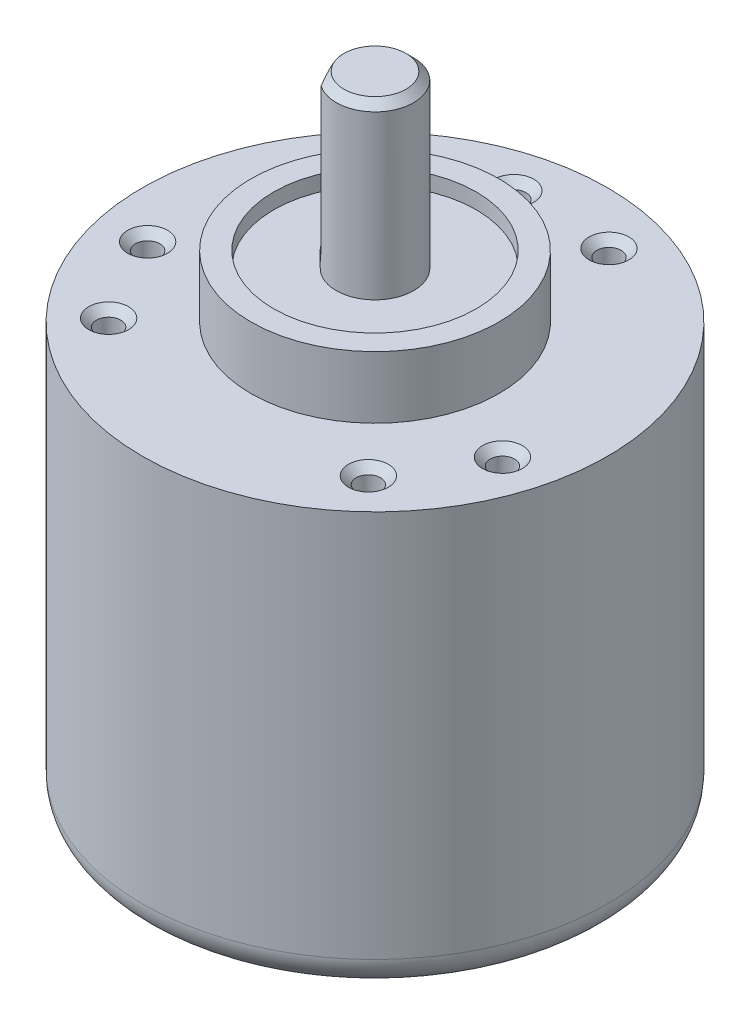
ISO-10303-21;
HEADER;
FILE_DESCRIPTION(('STEP AP214'),'2;1');
FILE_NAME('part.step','',(''),(''),'','','');
FILE_SCHEMA(('AUTOMOTIVE_DESIGN { 1 0 10303 214 1 1 1 1 }'));
ENDSEC;
DATA;
#1=APPLICATION_CONTEXT('core data for automotive mechanical design processes');
#2=APPLICATION_PROTOCOL_DEFINITION('international standard','automotive_design',2000,#1);
#3=PRODUCT_CONTEXT('',#1,'mechanical');
#4=PRODUCT('Part','Part','',(#3));
#5=PRODUCT_RELATED_PRODUCT_CATEGORY('part','',(#4));
#6=PRODUCT_DEFINITION_FORMATION('','',#4);
#7=PRODUCT_DEFINITION_CONTEXT('part definition',#1,'design');
#8=PRODUCT_DEFINITION('design','',#6,#7);
#9=PRODUCT_DEFINITION_SHAPE('','',#8);
#10=(LENGTH_UNIT() NAMED_UNIT(*) SI_UNIT(.MILLI.,.METRE.));
#11=(NAMED_UNIT(*) PLANE_ANGLE_UNIT() SI_UNIT($,.RADIAN.));
#12=(NAMED_UNIT(*) SI_UNIT($,.STERADIAN.) SOLID_ANGLE_UNIT());
#13=UNCERTAINTY_MEASURE_WITH_UNIT(LENGTH_MEASURE(1.E-05),#10,'distance_accuracy_value','');
#14=(GEOMETRIC_REPRESENTATION_CONTEXT(3) GLOBAL_UNCERTAINTY_ASSIGNED_CONTEXT((#13)) GLOBAL_UNIT_ASSIGNED_CONTEXT((#10,
#11,#12)) REPRESENTATION_CONTEXT('',''));
#15=CARTESIAN_POINT('',(0.,0.,0.));
#16=DIRECTION('',(0.,0.,1.));
#17=DIRECTION('',(1.,0.,0.));
#18=AXIS2_PLACEMENT_3D('',#15,#16,#17);
#19=CARTESIAN_POINT('',(0.,34.29,0.));
#20=DIRECTION('',(0.,-1.,0.));
#21=DIRECTION('',(0.,0.,-1.));
#22=AXIS2_PLACEMENT_3D('',#19,#20,#21);
#23=CYLINDRICAL_SURFACE('',#22,19.05);
#24=CARTESIAN_POINT('',(0.,2.54,0.));
#25=DIRECTION('',(0.,1.,0.));
#26=DIRECTION('',(0.,0.,1.));
#27=AXIS2_PLACEMENT_3D('',#24,#25,#26);
#28=CIRCLE('',#27,19.05);
#29=CARTESIAN_POINT('',(0.,2.54,19.05));
#30=VERTEX_POINT('',#29);
#31=EDGE_CURVE('E113',#30,#30,#28,.T.);
#32=ORIENTED_EDGE('',*,*,#31,.T.);
#33=EDGE_LOOP('',(#32));
#34=FACE_BOUND('',#33,.T.);
#35=CARTESIAN_POINT('',(0.,34.29,0.));
#36=DIRECTION('',(0.,1.,0.));
#37=DIRECTION('',(0.,0.,1.));
#38=AXIS2_PLACEMENT_3D('',#35,#36,#37);
#39=CIRCLE('',#38,19.05);
#40=CARTESIAN_POINT('',(0.,34.29,19.05));
#41=VERTEX_POINT('',#40);
#42=EDGE_CURVE('E108',#41,#41,#39,.T.);
#43=ORIENTED_EDGE('',*,*,#42,.F.);
#44=EDGE_LOOP('',(#43));
#45=FACE_BOUND('',#44,.T.);
#46=ADVANCED_FACE('F43',(#34,#45),#23,.T.);
#47=CARTESIAN_POINT('',(0.,34.29,0.));
#48=DIRECTION('',(0.,1.,0.));
#49=DIRECTION('',(0.,0.,1.));
#50=AXIS2_PLACEMENT_3D('',#47,#48,#49);
#51=PLANE('',#50);
#52=CARTESIAN_POINT('',(10.6364561950587,34.29,11.1788250661954));
#53=DIRECTION('',(0.,1.,0.));
#54=DIRECTION('',(0.,0.,1.));
#55=AXIS2_PLACEMENT_3D('',#52,#53,#54);
#56=CIRCLE('',#55,1.63195000000001);
#57=CARTESIAN_POINT('',(10.6364561950587,34.29,12.8107750661954));
#58=VERTEX_POINT('',#57);
#59=EDGE_CURVE('E329',#58,#58,#56,.F.);
#60=ORIENTED_EDGE('',*,*,#59,.T.);
#61=EDGE_LOOP('',(#60));
#62=FACE_BOUND('',#61,.T.);
#63=CARTESIAN_POINT('',(14.8008538042589,34.29,4.36291839425809));
#64=DIRECTION('',(0.,1.,0.));
#65=DIRECTION('',(0.,0.,1.));
#66=AXIS2_PLACEMENT_3D('',#63,#64,#65);
#67=CIRCLE('',#66,1.63195000000001);
#68=CARTESIAN_POINT('',(14.8008538042589,34.29,5.99486839425809));
#69=VERTEX_POINT('',#68);
#70=EDGE_CURVE('E325',#69,#69,#67,.F.);
#71=ORIENTED_EDGE('',*,*,#70,.T.);
#72=EDGE_LOOP('',(#71));
#73=FACE_BOUND('',#72,.T.);
#74=CARTESIAN_POINT('',(4.36291839425804,34.29,-14.8008538042589));
#75=DIRECTION('',(0.,1.,0.));
#76=DIRECTION('',(0.,0.,1.));
#77=AXIS2_PLACEMENT_3D('',#74,#75,#76);
#78=CIRCLE('',#77,1.63195);
#79=CARTESIAN_POINT('',(4.36291839425804,34.29,-13.1689038042589));
#80=VERTEX_POINT('',#79);
#81=EDGE_CURVE('E321',#80,#80,#78,.F.);
#82=ORIENTED_EDGE('',*,*,#81,.T.);
#83=EDGE_LOOP('',(#82));
#84=FACE_BOUND('',#83,.T.);
#85=CARTESIAN_POINT('',(-3.62202873806359,34.29,-14.9993745893168));
#86=DIRECTION('',(0.,1.,0.));
#87=DIRECTION('',(0.,0.,1.));
#88=AXIS2_PLACEMENT_3D('',#85,#86,#87);
#89=CIRCLE('',#88,1.63195000000001);
#90=CARTESIAN_POINT('',(-3.62202873806359,34.29,-13.3674245893168));
#91=VERTEX_POINT('',#90);
#92=EDGE_CURVE('E317',#91,#91,#89,.F.);
#93=ORIENTED_EDGE('',*,*,#92,.T.);
#94=EDGE_LOOP('',(#93));
#95=FACE_BOUND('',#94,.T.);
#96=CARTESIAN_POINT('',(-14.9993745893168,34.29,3.62202873806364));
#97=DIRECTION('',(0.,1.,0.));
#98=DIRECTION('',(0.,0.,1.));
#99=AXIS2_PLACEMENT_3D('',#96,#97,#98);
#100=CIRCLE('',#99,1.63195000000001);
#101=CARTESIAN_POINT('',(-14.9993745893168,34.29,5.25397873806365));
#102=VERTEX_POINT('',#101);
#103=EDGE_CURVE('E313',#102,#102,#100,.F.);
#104=ORIENTED_EDGE('',*,*,#103,.T.);
#105=EDGE_LOOP('',(#104));
#106=FACE_BOUND('',#105,.T.);
#107=CARTESIAN_POINT('',(-11.1788250661953,34.29,10.6364561950588));
#108=DIRECTION('',(0.,1.,0.));
#109=DIRECTION('',(0.,0.,1.));
#110=AXIS2_PLACEMENT_3D('',#107,#108,#109);
#111=CIRCLE('',#110,1.63195000000001);
#112=CARTESIAN_POINT('',(-11.1788250661953,34.29,12.2684061950588));
#113=VERTEX_POINT('',#112);
#114=EDGE_CURVE('E307',#113,#113,#111,.F.);
#115=ORIENTED_EDGE('',*,*,#114,.T.);
#116=EDGE_LOOP('',(#115));
#117=FACE_BOUND('',#116,.T.);
#118=CARTESIAN_POINT('',(0.,34.29,0.));
#119=DIRECTION('',(0.,1.,0.));
#120=DIRECTION('',(0.,0.,1.));
#121=AXIS2_PLACEMENT_3D('',#118,#119,#120);
#122=CIRCLE('',#121,10.16);
#123=CARTESIAN_POINT('',(0.,34.29,10.16));
#124=VERTEX_POINT('',#123);
#125=EDGE_CURVE('E109',#124,#124,#122,.T.);
#126=ORIENTED_EDGE('',*,*,#125,.F.);
#127=EDGE_LOOP('',(#126));
#128=FACE_BOUND('',#127,.T.);
#129=ORIENTED_EDGE('',*,*,#42,.T.);
#130=EDGE_LOOP('',(#129));
#131=FACE_BOUND('',#130,.T.);
#132=ADVANCED_FACE('F166',(#62,#73,#84,#95,#106,#117,#128,#131),#51,.T.);
#133=CARTESIAN_POINT('',(0.,0.,0.));
#134=DIRECTION('',(0.,1.,0.));
#135=DIRECTION('',(0.,0.,1.));
#136=AXIS2_PLACEMENT_3D('',#133,#134,#135);
#137=PLANE('',#136);
#138=CARTESIAN_POINT('',(0.,0.,0.));
#139=DIRECTION('',(0.,1.,0.));
#140=DIRECTION('',(0.,0.,1.));
#141=AXIS2_PLACEMENT_3D('',#138,#139,#140);
#142=CIRCLE('',#141,16.51);
#143=CARTESIAN_POINT('',(0.,0.,16.51));
#144=VERTEX_POINT('',#143);
#145=EDGE_CURVE('E120',#144,#144,#142,.F.);
#146=ORIENTED_EDGE('',*,*,#145,.T.);
#147=EDGE_LOOP('',(#146));
#148=FACE_BOUND('',#147,.T.);
#149=ADVANCED_FACE('F164',(#148),#137,.F.);
#150=CARTESIAN_POINT('',(0.,39.37,0.));
#151=DIRECTION('',(0.,-1.,0.));
#152=DIRECTION('',(0.,0.,-1.));
#153=AXIS2_PLACEMENT_3D('',#150,#151,#152);
#154=CYLINDRICAL_SURFACE('',#153,10.16);
#155=CARTESIAN_POINT('',(0.,39.37,0.));
#156=DIRECTION('',(0.,1.,0.));
#157=DIRECTION('',(0.,0.,1.));
#158=AXIS2_PLACEMENT_3D('',#155,#156,#157);
#159=CIRCLE('',#158,10.16);
#160=CARTESIAN_POINT('',(0.,39.37,10.16));
#161=VERTEX_POINT('',#160);
#162=EDGE_CURVE('E104',#161,#161,#159,.T.);
#163=ORIENTED_EDGE('',*,*,#162,.F.);
#164=EDGE_LOOP('',(#163));
#165=FACE_BOUND('',#164,.T.);
#166=ORIENTED_EDGE('',*,*,#125,.T.);
#167=EDGE_LOOP('',(#166));
#168=FACE_BOUND('',#167,.T.);
#169=ADVANCED_FACE('F160',(#165,#168),#154,.T.);
#170=CARTESIAN_POINT('',(0.,39.37,0.));
#171=DIRECTION('',(0.,1.,0.));
#172=DIRECTION('',(0.,0.,1.));
#173=AXIS2_PLACEMENT_3D('',#170,#171,#172);
#174=PLANE('',#173);
#175=CARTESIAN_POINT('',(0.,39.37,0.));
#176=DIRECTION('',(0.,1.,0.));
#177=DIRECTION('',(0.,0.,1.));
#178=AXIS2_PLACEMENT_3D('',#175,#176,#177);
#179=CIRCLE('',#178,8.29671531470928);
#180=CARTESIAN_POINT('',(0.,39.37,8.29671531470928));
#181=VERTEX_POINT('',#180);
#182=EDGE_CURVE('E256',#181,#181,#179,.T.);
#183=ORIENTED_EDGE('',*,*,#182,.F.);
#184=EDGE_LOOP('',(#183));
#185=FACE_BOUND('',#184,.T.);
#186=ORIENTED_EDGE('',*,*,#162,.T.);
#187=EDGE_LOOP('',(#186));
#188=FACE_BOUND('',#187,.T.);
#189=ADVANCED_FACE('F156',(#185,#188),#174,.T.);
#190=CARTESIAN_POINT('',(0.,2.54,0.));
#191=DIRECTION('',(0.,1.,0.));
#192=DIRECTION('',(0.,0.,1.));
#193=AXIS2_PLACEMENT_3D('',#190,#191,#192);
#194=TOROIDAL_SURFACE('',#193,16.51,2.54);
#195=ORIENTED_EDGE('',*,*,#145,.F.);
#196=EDGE_LOOP('',(#195));
#197=FACE_BOUND('',#196,.T.);
#198=ORIENTED_EDGE('',*,*,#31,.F.);
#199=EDGE_LOOP('',(#198));
#200=FACE_BOUND('',#199,.T.);
#201=ADVANCED_FACE('F159',(#197,#200),#194,.T.);
#202=CARTESIAN_POINT('',(-11.1788250661953,21.59,10.6364561950588));
#203=DIRECTION('',(0.,1.,0.));
#204=DIRECTION('',(0.,0.,1.));
#205=AXIS2_PLACEMENT_3D('',#202,#203,#204);
#206=CYLINDRICAL_SURFACE('',#205,0.99695);
#207=CARTESIAN_POINT('',(-11.1788250661953,33.655,10.6364561950588));
#208=DIRECTION('',(0.,1.,0.));
#209=DIRECTION('',(0.,0.,1.));
#210=AXIS2_PLACEMENT_3D('',#207,#208,#209);
#211=CIRCLE('',#210,0.99695);
#212=CARTESIAN_POINT('',(-11.1788250661953,33.655,11.6334061950588));
#213=VERTEX_POINT('',#212);
#214=EDGE_CURVE('E11',#213,#213,#211,.T.);
#215=ORIENTED_EDGE('',*,*,#214,.T.);
#216=EDGE_LOOP('',(#215));
#217=FACE_BOUND('',#216,.T.);
#218=CARTESIAN_POINT('',(-11.1788250661953,21.59,10.6364561950588));
#219=DIRECTION('',(0.,1.,0.));
#220=DIRECTION('',(0.,0.,1.));
#221=AXIS2_PLACEMENT_3D('',#218,#219,#220);
#222=CIRCLE('',#221,0.99695);
#223=CARTESIAN_POINT('',(-11.1788250661953,21.59,11.6334061950588));
#224=VERTEX_POINT('',#223);
#225=EDGE_CURVE('E94',#224,#224,#222,.T.);
#226=ORIENTED_EDGE('',*,*,#225,.F.);
#227=EDGE_LOOP('',(#226));
#228=FACE_BOUND('',#227,.T.);
#229=ADVANCED_FACE('F176',(#217,#228),#206,.F.);
#230=CARTESIAN_POINT('',(-11.1788250661953,21.59,10.6364561950588));
#231=DIRECTION('',(0.,1.,0.));
#232=DIRECTION('',(0.,0.,1.));
#233=AXIS2_PLACEMENT_3D('',#230,#231,#232);
#234=PLANE('',#233);
#235=ORIENTED_EDGE('',*,*,#225,.T.);
#236=EDGE_LOOP('',(#235));
#237=FACE_BOUND('',#236,.T.);
#238=ADVANCED_FACE('F181',(#237),#234,.T.);
#239=CARTESIAN_POINT('',(-14.9993745893168,21.59,3.62202873806364));
#240=DIRECTION('',(0.,1.,0.));
#241=DIRECTION('',(0.,0.,1.));
#242=AXIS2_PLACEMENT_3D('',#239,#240,#241);
#243=CYLINDRICAL_SURFACE('',#242,0.99695);
#244=CARTESIAN_POINT('',(-14.9993745893168,33.655,3.62202873806364));
#245=DIRECTION('',(0.,1.,0.));
#246=DIRECTION('',(0.,0.,1.));
#247=AXIS2_PLACEMENT_3D('',#244,#245,#246);
#248=CIRCLE('',#247,0.99695);
#249=CARTESIAN_POINT('',(-14.9993745893168,33.655,4.61897873806364));
#250=VERTEX_POINT('',#249);
#251=EDGE_CURVE('E53',#250,#250,#248,.T.);
#252=ORIENTED_EDGE('',*,*,#251,.T.);
#253=EDGE_LOOP('',(#252));
#254=FACE_BOUND('',#253,.T.);
#255=CARTESIAN_POINT('',(-14.9993745893168,21.59,3.62202873806364));
#256=DIRECTION('',(0.,1.,0.));
#257=DIRECTION('',(0.,0.,1.));
#258=AXIS2_PLACEMENT_3D('',#255,#256,#257);
#259=CIRCLE('',#258,0.99695);
#260=CARTESIAN_POINT('',(-14.9993745893168,21.59,4.61897873806364));
#261=VERTEX_POINT('',#260);
#262=EDGE_CURVE('E98',#261,#261,#259,.T.);
#263=ORIENTED_EDGE('',*,*,#262,.F.);
#264=EDGE_LOOP('',(#263));
#265=FACE_BOUND('',#264,.T.);
#266=ADVANCED_FACE('F192',(#254,#265),#243,.F.);
#267=CARTESIAN_POINT('',(-14.9993745893168,21.59,3.62202873806364));
#268=DIRECTION('',(0.,1.,0.));
#269=DIRECTION('',(0.,0.,1.));
#270=AXIS2_PLACEMENT_3D('',#267,#268,#269);
#271=PLANE('',#270);
#272=ORIENTED_EDGE('',*,*,#262,.T.);
#273=EDGE_LOOP('',(#272));
#274=FACE_BOUND('',#273,.T.);
#275=ADVANCED_FACE('F226',(#274),#271,.T.);
#276=CARTESIAN_POINT('',(-3.62202873806359,21.59,-14.9993745893168));
#277=DIRECTION('',(0.,1.,0.));
#278=DIRECTION('',(0.,0.,1.));
#279=AXIS2_PLACEMENT_3D('',#276,#277,#278);
#280=CYLINDRICAL_SURFACE('',#279,0.996949999999998);
#281=CARTESIAN_POINT('',(-3.62202873806359,33.655,-14.9993745893168));
#282=DIRECTION('',(0.,1.,0.));
#283=DIRECTION('',(0.,0.,1.));
#284=AXIS2_PLACEMENT_3D('',#281,#282,#283);
#285=CIRCLE('',#284,0.996949999999998);
#286=CARTESIAN_POINT('',(-3.62202873806359,33.655,-14.0024245893168));
#287=VERTEX_POINT('',#286);
#288=EDGE_CURVE('E341',#287,#287,#285,.T.);
#289=ORIENTED_EDGE('',*,*,#288,.T.);
#290=EDGE_LOOP('',(#289));
#291=FACE_BOUND('',#290,.T.);
#292=CARTESIAN_POINT('',(-3.62202873806359,21.59,-14.9993745893168));
#293=DIRECTION('',(0.,1.,0.));
#294=DIRECTION('',(0.,0.,1.));
#295=AXIS2_PLACEMENT_3D('',#292,#293,#294);
#296=CIRCLE('',#295,0.996949999999998);
#297=CARTESIAN_POINT('',(-3.62202873806359,21.59,-14.0024245893168));
#298=VERTEX_POINT('',#297);
#299=EDGE_CURVE('E269',#298,#298,#296,.T.);
#300=ORIENTED_EDGE('',*,*,#299,.F.);
#301=EDGE_LOOP('',(#300));
#302=FACE_BOUND('',#301,.T.);
#303=ADVANCED_FACE('F223',(#291,#302),#280,.F.);
#304=CARTESIAN_POINT('',(-3.62202873806359,21.59,-14.9993745893168));
#305=DIRECTION('',(0.,1.,0.));
#306=DIRECTION('',(0.,0.,1.));
#307=AXIS2_PLACEMENT_3D('',#304,#305,#306);
#308=PLANE('',#307);
#309=ORIENTED_EDGE('',*,*,#299,.T.);
#310=EDGE_LOOP('',(#309));
#311=FACE_BOUND('',#310,.T.);
#312=ADVANCED_FACE('F218',(#311),#308,.T.);
#313=CARTESIAN_POINT('',(4.36291839425804,21.59,-14.8008538042589));
#314=DIRECTION('',(0.,1.,0.));
#315=DIRECTION('',(0.,0.,1.));
#316=AXIS2_PLACEMENT_3D('',#313,#314,#315);
#317=CYLINDRICAL_SURFACE('',#316,0.996950000000002);
#318=CARTESIAN_POINT('',(4.36291839425804,33.655,-14.8008538042589));
#319=DIRECTION('',(0.,1.,0.));
#320=DIRECTION('',(0.,0.,1.));
#321=AXIS2_PLACEMENT_3D('',#318,#319,#320);
#322=CIRCLE('',#321,0.996950000000002);
#323=CARTESIAN_POINT('',(4.36291839425804,33.655,-13.8039038042589));
#324=VERTEX_POINT('',#323);
#325=EDGE_CURVE('E337',#324,#324,#322,.T.);
#326=ORIENTED_EDGE('',*,*,#325,.T.);
#327=EDGE_LOOP('',(#326));
#328=FACE_BOUND('',#327,.T.);
#329=CARTESIAN_POINT('',(4.36291839425804,21.59,-14.8008538042589));
#330=DIRECTION('',(0.,1.,0.));
#331=DIRECTION('',(0.,0.,1.));
#332=AXIS2_PLACEMENT_3D('',#329,#330,#331);
#333=CIRCLE('',#332,0.996950000000002);
#334=CARTESIAN_POINT('',(4.36291839425804,21.59,-13.8039038042589));
#335=VERTEX_POINT('',#334);
#336=EDGE_CURVE('E273',#335,#335,#333,.T.);
#337=ORIENTED_EDGE('',*,*,#336,.F.);
#338=EDGE_LOOP('',(#337));
#339=FACE_BOUND('',#338,.T.);
#340=ADVANCED_FACE('F215',(#328,#339),#317,.F.);
#341=CARTESIAN_POINT('',(4.36291839425804,21.59,-14.8008538042589));
#342=DIRECTION('',(0.,1.,0.));
#343=DIRECTION('',(0.,0.,1.));
#344=AXIS2_PLACEMENT_3D('',#341,#342,#343);
#345=PLANE('',#344);
#346=ORIENTED_EDGE('',*,*,#336,.T.);
#347=EDGE_LOOP('',(#346));
#348=FACE_BOUND('',#347,.T.);
#349=ADVANCED_FACE('F210',(#348),#345,.T.);
#350=CARTESIAN_POINT('',(14.8008538042589,21.59,4.36291839425809));
#351=DIRECTION('',(0.,1.,0.));
#352=DIRECTION('',(0.,0.,1.));
#353=AXIS2_PLACEMENT_3D('',#350,#351,#352);
#354=CYLINDRICAL_SURFACE('',#353,0.996950000000001);
#355=CARTESIAN_POINT('',(14.8008538042589,33.655,4.36291839425809));
#356=DIRECTION('',(0.,1.,0.));
#357=DIRECTION('',(0.,0.,1.));
#358=AXIS2_PLACEMENT_3D('',#355,#356,#357);
#359=CIRCLE('',#358,0.996950000000001);
#360=CARTESIAN_POINT('',(14.8008538042589,33.655,5.35986839425809));
#361=VERTEX_POINT('',#360);
#362=EDGE_CURVE('E333',#361,#361,#359,.T.);
#363=ORIENTED_EDGE('',*,*,#362,.T.);
#364=EDGE_LOOP('',(#363));
#365=FACE_BOUND('',#364,.T.);
#366=CARTESIAN_POINT('',(14.8008538042589,21.59,4.36291839425809));
#367=DIRECTION('',(0.,1.,0.));
#368=DIRECTION('',(0.,0.,1.));
#369=AXIS2_PLACEMENT_3D('',#366,#367,#368);
#370=CIRCLE('',#369,0.996950000000001);
#371=CARTESIAN_POINT('',(14.8008538042589,21.59,5.35986839425809));
#372=VERTEX_POINT('',#371);
#373=EDGE_CURVE('E261',#372,#372,#370,.T.);
#374=ORIENTED_EDGE('',*,*,#373,.F.);
#375=EDGE_LOOP('',(#374));
#376=FACE_BOUND('',#375,.T.);
#377=ADVANCED_FACE('F207',(#365,#376),#354,.F.);
#378=CARTESIAN_POINT('',(14.8008538042589,21.59,4.36291839425809));
#379=DIRECTION('',(0.,1.,0.));
#380=DIRECTION('',(0.,0.,1.));
#381=AXIS2_PLACEMENT_3D('',#378,#379,#380);
#382=PLANE('',#381);
#383=ORIENTED_EDGE('',*,*,#373,.T.);
#384=EDGE_LOOP('',(#383));
#385=FACE_BOUND('',#384,.T.);
#386=ADVANCED_FACE('F201',(#385),#382,.T.);
#387=CARTESIAN_POINT('',(10.6364561950587,21.59,11.1788250661954));
#388=DIRECTION('',(0.,1.,0.));
#389=DIRECTION('',(0.,0.,1.));
#390=AXIS2_PLACEMENT_3D('',#387,#388,#389);
#391=CYLINDRICAL_SURFACE('',#390,0.996950000000001);
#392=CARTESIAN_POINT('',(10.6364561950587,33.655,11.1788250661954));
#393=DIRECTION('',(0.,1.,0.));
#394=DIRECTION('',(0.,0.,1.));
#395=AXIS2_PLACEMENT_3D('',#392,#393,#394);
#396=CIRCLE('',#395,0.996950000000001);
#397=CARTESIAN_POINT('',(10.6364561950587,33.655,12.1757750661954));
#398=VERTEX_POINT('',#397);
#399=EDGE_CURVE('E304',#398,#398,#396,.T.);
#400=ORIENTED_EDGE('',*,*,#399,.T.);
#401=EDGE_LOOP('',(#400));
#402=FACE_BOUND('',#401,.T.);
#403=CARTESIAN_POINT('',(10.6364561950587,21.59,11.1788250661954));
#404=DIRECTION('',(0.,1.,0.));
#405=DIRECTION('',(0.,0.,1.));
#406=AXIS2_PLACEMENT_3D('',#403,#404,#405);
#407=CIRCLE('',#406,0.996950000000001);
#408=CARTESIAN_POINT('',(10.6364561950587,21.59,12.1757750661954));
#409=VERTEX_POINT('',#408);
#410=EDGE_CURVE('E255',#409,#409,#407,.T.);
#411=ORIENTED_EDGE('',*,*,#410,.F.);
#412=EDGE_LOOP('',(#411));
#413=FACE_BOUND('',#412,.T.);
#414=ADVANCED_FACE('F197',(#402,#413),#391,.F.);
#415=CARTESIAN_POINT('',(10.6364561950587,21.59,11.1788250661954));
#416=DIRECTION('',(0.,1.,0.));
#417=DIRECTION('',(0.,0.,1.));
#418=AXIS2_PLACEMENT_3D('',#415,#416,#417);
#419=PLANE('',#418);
#420=ORIENTED_EDGE('',*,*,#410,.T.);
#421=EDGE_LOOP('',(#420));
#422=FACE_BOUND('',#421,.T.);
#423=ADVANCED_FACE('F200',(#422),#419,.T.);
#424=CARTESIAN_POINT('',(10.6364561950587,33.655,11.1788250661954));
#425=DIRECTION('',(0.,1.,0.));
#426=DIRECTION('',(0.,0.,1.));
#427=AXIS2_PLACEMENT_3D('',#424,#425,#426);
#428=CONICAL_SURFACE('',#427,0.996950000000001,0.785398163397445);
#429=ORIENTED_EDGE('',*,*,#59,.F.);
#430=EDGE_LOOP('',(#429));
#431=FACE_BOUND('',#430,.T.);
#432=ORIENTED_EDGE('',*,*,#399,.F.);
#433=EDGE_LOOP('',(#432));
#434=FACE_BOUND('',#433,.T.);
#435=ADVANCED_FACE('F205',(#431,#434),#428,.F.);
#436=CARTESIAN_POINT('',(14.8008538042589,33.655,4.36291839425809));
#437=DIRECTION('',(0.,1.,0.));
#438=DIRECTION('',(0.,0.,1.));
#439=AXIS2_PLACEMENT_3D('',#436,#437,#438);
#440=CONICAL_SURFACE('',#439,0.996950000000001,0.785398163397445);
#441=ORIENTED_EDGE('',*,*,#70,.F.);
#442=EDGE_LOOP('',(#441));
#443=FACE_BOUND('',#442,.T.);
#444=ORIENTED_EDGE('',*,*,#362,.F.);
#445=EDGE_LOOP('',(#444));
#446=FACE_BOUND('',#445,.T.);
#447=ADVANCED_FACE('F374',(#443,#446),#440,.F.);
#448=CARTESIAN_POINT('',(4.36291839425804,33.655,-14.8008538042589));
#449=DIRECTION('',(0.,1.,0.));
#450=DIRECTION('',(0.,0.,1.));
#451=AXIS2_PLACEMENT_3D('',#448,#449,#450);
#452=CONICAL_SURFACE('',#451,0.996950000000002,0.785398163397442);
#453=ORIENTED_EDGE('',*,*,#81,.F.);
#454=EDGE_LOOP('',(#453));
#455=FACE_BOUND('',#454,.T.);
#456=ORIENTED_EDGE('',*,*,#325,.F.);
#457=EDGE_LOOP('',(#456));
#458=FACE_BOUND('',#457,.T.);
#459=ADVANCED_FACE('F357',(#455,#458),#452,.F.);
#460=CARTESIAN_POINT('',(-3.62202873806359,33.655,-14.9993745893168));
#461=DIRECTION('',(0.,1.,0.));
#462=DIRECTION('',(0.,0.,1.));
#463=AXIS2_PLACEMENT_3D('',#460,#461,#462);
#464=CONICAL_SURFACE('',#463,0.996949999999998,0.78539816339745);
#465=ORIENTED_EDGE('',*,*,#92,.F.);
#466=EDGE_LOOP('',(#465));
#467=FACE_BOUND('',#466,.T.);
#468=ORIENTED_EDGE('',*,*,#288,.F.);
#469=EDGE_LOOP('',(#468));
#470=FACE_BOUND('',#469,.T.);
#471=ADVANCED_FACE('F350',(#467,#470),#464,.F.);
#472=CARTESIAN_POINT('',(-14.9993745893168,33.655,3.62202873806364));
#473=DIRECTION('',(0.,1.,0.));
#474=DIRECTION('',(0.,0.,1.));
#475=AXIS2_PLACEMENT_3D('',#472,#473,#474);
#476=CONICAL_SURFACE('',#475,0.99695,0.785398163397445);
#477=ORIENTED_EDGE('',*,*,#103,.F.);
#478=EDGE_LOOP('',(#477));
#479=FACE_BOUND('',#478,.T.);
#480=ORIENTED_EDGE('',*,*,#251,.F.);
#481=EDGE_LOOP('',(#480));
#482=FACE_BOUND('',#481,.T.);
#483=ADVANCED_FACE('F348',(#479,#482),#476,.F.);
#484=CARTESIAN_POINT('',(-11.1788250661953,33.655,10.6364561950588));
#485=DIRECTION('',(0.,1.,0.));
#486=DIRECTION('',(0.,0.,1.));
#487=AXIS2_PLACEMENT_3D('',#484,#485,#486);
#488=CONICAL_SURFACE('',#487,0.99695,0.785398163397445);
#489=ORIENTED_EDGE('',*,*,#114,.F.);
#490=EDGE_LOOP('',(#489));
#491=FACE_BOUND('',#490,.T.);
#492=ORIENTED_EDGE('',*,*,#214,.F.);
#493=EDGE_LOOP('',(#492));
#494=FACE_BOUND('',#493,.T.);
#495=ADVANCED_FACE('F46',(#491,#494),#488,.F.);
#496=CARTESIAN_POINT('',(0.,38.1,0.));
#497=DIRECTION('',(0.,1.,0.));
#498=DIRECTION('',(0.,0.,1.));
#499=AXIS2_PLACEMENT_3D('',#496,#497,#498);
#500=CYLINDRICAL_SURFACE('',#499,8.29671531470928);
#501=CARTESIAN_POINT('',(0.,38.1,0.));
#502=DIRECTION('',(0.,1.,0.));
#503=DIRECTION('',(0.,0.,1.));
#504=AXIS2_PLACEMENT_3D('',#501,#502,#503);
#505=CIRCLE('',#504,8.29671531470928);
#506=CARTESIAN_POINT('',(0.,38.1,8.29671531470928));
#507=VERTEX_POINT('',#506);
#508=EDGE_CURVE('E253',#507,#507,#505,.T.);
#509=ORIENTED_EDGE('',*,*,#508,.F.);
#510=EDGE_LOOP('',(#509));
#511=FACE_BOUND('',#510,.T.);
#512=ORIENTED_EDGE('',*,*,#182,.T.);
#513=EDGE_LOOP('',(#512));
#514=FACE_BOUND('',#513,.T.);
#515=ADVANCED_FACE('F237',(#511,#514),#500,.F.);
#516=CARTESIAN_POINT('',(0.,38.1,0.));
#517=DIRECTION('',(0.,1.,0.));
#518=DIRECTION('',(0.,0.,1.));
#519=AXIS2_PLACEMENT_3D('',#516,#517,#518);
#520=PLANE('',#519);
#521=CARTESIAN_POINT('',(0.,38.1,0.));
#522=DIRECTION('',(0.,1.,0.));
#523=DIRECTION('',(0.,0.,1.));
#524=AXIS2_PLACEMENT_3D('',#521,#522,#523);
#525=CIRCLE('',#524,3.175);
#526=CARTESIAN_POINT('',(0.,38.1,3.175));
#527=VERTEX_POINT('',#526);
#528=EDGE_CURVE('E83',#527,#527,#525,.T.);
#529=ORIENTED_EDGE('',*,*,#528,.F.);
#530=EDGE_LOOP('',(#529));
#531=FACE_BOUND('',#530,.T.);
#532=ORIENTED_EDGE('',*,*,#508,.T.);
#533=EDGE_LOOP('',(#532));
#534=FACE_BOUND('',#533,.T.);
#535=ADVANCED_FACE('F240',(#531,#534),#520,.T.);
#536=CARTESIAN_POINT('',(0.,52.07,0.));
#537=DIRECTION('',(0.,1.,0.));
#538=DIRECTION('',(0.,0.,1.));
#539=AXIS2_PLACEMENT_3D('',#536,#537,#538);
#540=PLANE('',#539);
#541=CARTESIAN_POINT('',(0.,52.07,0.));
#542=DIRECTION('',(0.,1.,0.));
#543=DIRECTION('',(0.,0.,1.));
#544=AXIS2_PLACEMENT_3D('',#541,#542,#543);
#545=CIRCLE('',#544,2.54000000000001);
#546=CARTESIAN_POINT('',(-2.40761855645804,52.07,0.809303951923435));
#547=VERTEX_POINT('',#546);
#548=EDGE_CURVE('E124',#547,#547,#545,.T.);
#549=ORIENTED_EDGE('',*,*,#548,.T.);
#550=EDGE_LOOP('',(#549));
#551=FACE_BOUND('',#550,.T.);
#552=ADVANCED_FACE('F151',(#551),#540,.T.);
#553=CARTESIAN_POINT('',(0.,52.07,0.));
#554=DIRECTION('',(0.,-1.,0.));
#555=DIRECTION('',(0.,0.,-1.));
#556=AXIS2_PLACEMENT_3D('',#553,#554,#555);
#557=CONICAL_SURFACE('',#556,2.54000000000001,0.785398163397448);
#558=CARTESIAN_POINT('',(-1.80064059251547,51.435,2.61501786926697));
#559=CARTESIAN_POINT('',(-1.82992518051094,51.4900845964951,2.52789841642287));
#560=CARTESIAN_POINT('',(-1.85957318962727,51.5434182514811,2.43969781300203));
#561=CARTESIAN_POINT('',(-1.91981197270842,51.645368335065,2.26049195144663));
#562=CARTESIAN_POINT('',(-1.95040569715918,51.6939675030268,2.16947791583772));
#563=CARTESIAN_POINT('',(-2.01174884961405,51.7836584235123,1.98698663822691));
#564=CARTESIAN_POINT('',(-2.04247407358572,51.8249110045996,1.89558140140617));
#565=CARTESIAN_POINT('',(-2.10484959404226,51.8995774512077,1.71001890642145));
#566=CARTESIAN_POINT('',(-2.13649854550543,51.9330021313615,1.61586564959617));
#567=CARTESIAN_POINT('',(-2.1878680115933,51.9786693511487,1.46304534086721));
#568=CARTESIAN_POINT('',(-2.20730726450343,51.9940414305555,1.40521502146883));
#569=CARTESIAN_POINT('',(-2.24646169087431,52.0208248768978,1.28873353972893));
#570=CARTESIAN_POINT('',(-2.26617682925468,52.0322367427204,1.23008248174892));
#571=CARTESIAN_POINT('',(-2.30611072719804,52.0508574475105,1.11128213054386));
#572=CARTESIAN_POINT('',(-2.32633261217278,52.058001042313,1.05112353945329));
#573=CARTESIAN_POINT('',(-2.36690748452114,52.0675899825541,0.930416337468622));
#574=CARTESIAN_POINT('',(-2.38726057734969,52.0700309009347,0.86986741285398));
#575=CARTESIAN_POINT('',(-2.40761855645804,52.07,0.809303951923438));
#576=B_SPLINE_CURVE_WITH_KNOTS('',3,(#558,#559,#560,#561,#562,#563,#564,#565,#566,#567,#568,
#569,#570,#571,#572,#573,#574,#575),.UNSPECIFIED.,.F.,.F.,(4,2,2,2,2,2,2,2,4),(0.,
0.321557694063411,0.644246966487349,0.95864394581836,1.27260397348778,1.46124300814554,
1.64985827040382,1.84128745028141,2.03289675201268),.UNSPECIFIED.);
#577=CARTESIAN_POINT('',(-1.80064059251547,51.435,2.61501786926697));
#578=VERTEX_POINT('',#577);
#579=EDGE_CURVE('E128',#578,#547,#576,.T.);
#580=ORIENTED_EDGE('',*,*,#579,.F.);
#581=CARTESIAN_POINT('',(0.,51.435,0.));
#582=DIRECTION('',(0.,1.,0.));
#583=DIRECTION('',(0.,0.,1.));
#584=AXIS2_PLACEMENT_3D('',#581,#582,#583);
#585=CIRCLE('',#584,3.175);
#586=CARTESIAN_POINT('',(-3.01459652040062,51.435,-0.996409965420097));
#587=VERTEX_POINT('',#586);
#588=EDGE_CURVE('E67',#587,#578,#585,.F.);
#589=ORIENTED_EDGE('',*,*,#588,.F.);
#590=CARTESIAN_POINT('',(-2.40761855645805,52.07,0.809303951923439));
#591=CARTESIAN_POINT('',(-2.432503296628,52.0700653961201,0.735273716356899));
#592=CARTESIAN_POINT('',(-2.45737529022522,52.0663992809691,0.6612814008882));
#593=CARTESIAN_POINT('',(-2.50686943635008,52.0521199734107,0.514040028393928));
#594=CARTESIAN_POINT('',(-2.53149198009336,52.0415202781342,0.440789807531131));
#595=CARTESIAN_POINT('',(-2.57995396957516,52.0141161667089,0.296619023634725));
#596=CARTESIAN_POINT('',(-2.60379962791623,51.9974180076151,0.225679978574513));
#597=CARTESIAN_POINT('',(-2.65103918873538,51.9585584675779,0.0851458282632125));
#598=CARTESIAN_POINT('',(-2.6744329005817,51.936394833296,0.015551290127378));
#599=CARTESIAN_POINT('',(-2.72509889174639,51.8827641613277,-0.135176233468093));
#600=CARTESIAN_POINT('',(-2.75226651618203,51.8503301085374,-0.215997878501069));
#601=CARTESIAN_POINT('',(-2.80589727375404,51.7801164111149,-0.375545359790875));
#602=CARTESIAN_POINT('',(-2.83236005646267,51.74233416435,-0.454270153551487));
#603=CARTESIAN_POINT('',(-2.88517484395929,51.6616676981587,-0.611390185067509));
#604=CARTESIAN_POINT('',(-2.91151252817858,51.618692074948,-0.689742820205114));
#605=CARTESIAN_POINT('',(-2.96352214493193,51.5292544347115,-0.844467529150437));
#606=CARTESIAN_POINT('',(-2.98919516480729,51.4827986691029,-0.920842837716906));
#607=CARTESIAN_POINT('',(-3.01459652040062,51.435,-0.996409965420098));
#608=B_SPLINE_CURVE_WITH_KNOTS('',3,(#590,#591,#592,#593,#594,#595,#596,#597,#598,#599,#600,
#601,#602,#603,#604,#605,#606,#607),.UNSPECIFIED.,.F.,.F.,(4,2,2,2,2,2,2,2,4),(0.,
0.234152375535849,0.467850293541938,0.697656785613655,0.927558182541709,1.20100603698667,
1.4745873961436,1.75398610879515,2.0328944436649),.UNSPECIFIED.);
#609=EDGE_CURVE('E60',#547,#587,#608,.T.);
#610=ORIENTED_EDGE('',*,*,#609,.F.);
#611=ORIENTED_EDGE('',*,*,#548,.F.);
#612=EDGE_LOOP('',(#580,#589,#610,#611));
#613=FACE_BOUND('',#612,.T.);
#614=ADVANCED_FACE('F143',(#613),#557,.T.);
#615=DIRECTION('',(0.318623603119463,0.,0.947881321440174));
#616=VECTOR('',#615,1.);
#617=CARTESIAN_POINT('',(-3.01459652040062,39.37,-0.996409965420097));
#618=LINE('',#617,#616);
#619=CARTESIAN_POINT('',(-3.01459652040062,39.37,-0.996409965420097));
#620=VERTEX_POINT('',#619);
#621=CARTESIAN_POINT('',(-1.80064059251547,39.37,2.61501786926697));
#622=VERTEX_POINT('',#621);
#623=EDGE_CURVE('E81',#620,#622,#618,.T.);
#624=ORIENTED_EDGE('',*,*,#623,.F.);
#625=CARTESIAN_POINT('',(0.,39.37,0.));
#626=DIRECTION('',(0.,1.,0.));
#627=DIRECTION('',(0.,0.,1.));
#628=AXIS2_PLACEMENT_3D('',#625,#626,#627);
#629=CIRCLE('',#628,3.175);
#630=EDGE_CURVE('E78',#620,#622,#629,.T.);
#631=ORIENTED_EDGE('',*,*,#630,.T.);
#632=EDGE_LOOP('',(#624,#631));
#633=FACE_BOUND('',#632,.T.);
#634=ADVANCED_FACE('F79',(#633),#174,.T.);
#635=CARTESIAN_POINT('',(-3.01459652040062,52.07,-0.996409965420097));
#636=DIRECTION('',(0.947881321440174,0.,-0.318623603119463));
#637=DIRECTION('',(-0.318623603119463,0.,-0.947881321440174));
#638=AXIS2_PLACEMENT_3D('',#635,#636,#637);
#639=PLANE('',#638);
#640=ORIENTED_EDGE('',*,*,#579,.T.);
#641=ORIENTED_EDGE('',*,*,#609,.T.);
#642=DIRECTION('',(0.,-1.,0.));
#643=VECTOR('',#642,1.);
#644=CARTESIAN_POINT('',(-3.01459652040062,52.07,-0.996409965420097));
#645=LINE('',#644,#643);
#646=EDGE_CURVE('E90',#587,#620,#645,.T.);
#647=ORIENTED_EDGE('',*,*,#646,.T.);
#648=ORIENTED_EDGE('',*,*,#623,.T.);
#649=DIRECTION('',(0.,-1.,0.));
#650=VECTOR('',#649,1.);
#651=CARTESIAN_POINT('',(-1.80064059251547,52.07,2.61501786926697));
#652=LINE('',#651,#650);
#653=EDGE_CURVE('E85',#578,#622,#652,.T.);
#654=ORIENTED_EDGE('',*,*,#653,.F.);
#655=EDGE_LOOP('',(#640,#641,#647,#648,#654));
#656=FACE_BOUND('',#655,.T.);
#657=ADVANCED_FACE('F92',(#656),#639,.F.);
#658=CARTESIAN_POINT('',(0.,52.07,0.));
#659=DIRECTION('',(0.,-1.,0.));
#660=DIRECTION('',(0.,0.,-1.));
#661=AXIS2_PLACEMENT_3D('',#658,#659,#660);
#662=CYLINDRICAL_SURFACE('',#661,3.175);
#663=ORIENTED_EDGE('',*,*,#646,.F.);
#664=ORIENTED_EDGE('',*,*,#588,.T.);
#665=ORIENTED_EDGE('',*,*,#653,.T.);
#666=ORIENTED_EDGE('',*,*,#630,.F.);
#667=EDGE_LOOP('',(#663,#664,#665,#666));
#668=FACE_BOUND('',#667,.T.);
#669=ORIENTED_EDGE('',*,*,#528,.T.);
#670=EDGE_LOOP('',(#669));
#671=FACE_BOUND('',#670,.T.);
#672=ADVANCED_FACE('F86',(#668,#671),#662,.T.);
#673=CLOSED_SHELL('',(#46,#132,#149,#169,#189,#201,#229,#238,#266,#275,#303,#312,#340,#349,#377,
#386,#414,#423,#435,#447,#459,#471,#483,#495,#515,#535,#552,#614,#634,#657,#672));
#674=MANIFOLD_SOLID_BREP('B2',#673);
#675=ADVANCED_BREP_SHAPE_REPRESENTATION('',(#18,#674),#14);
#676=SHAPE_DEFINITION_REPRESENTATION(#9,#675);
ENDSEC;
END-ISO-10303-21;
